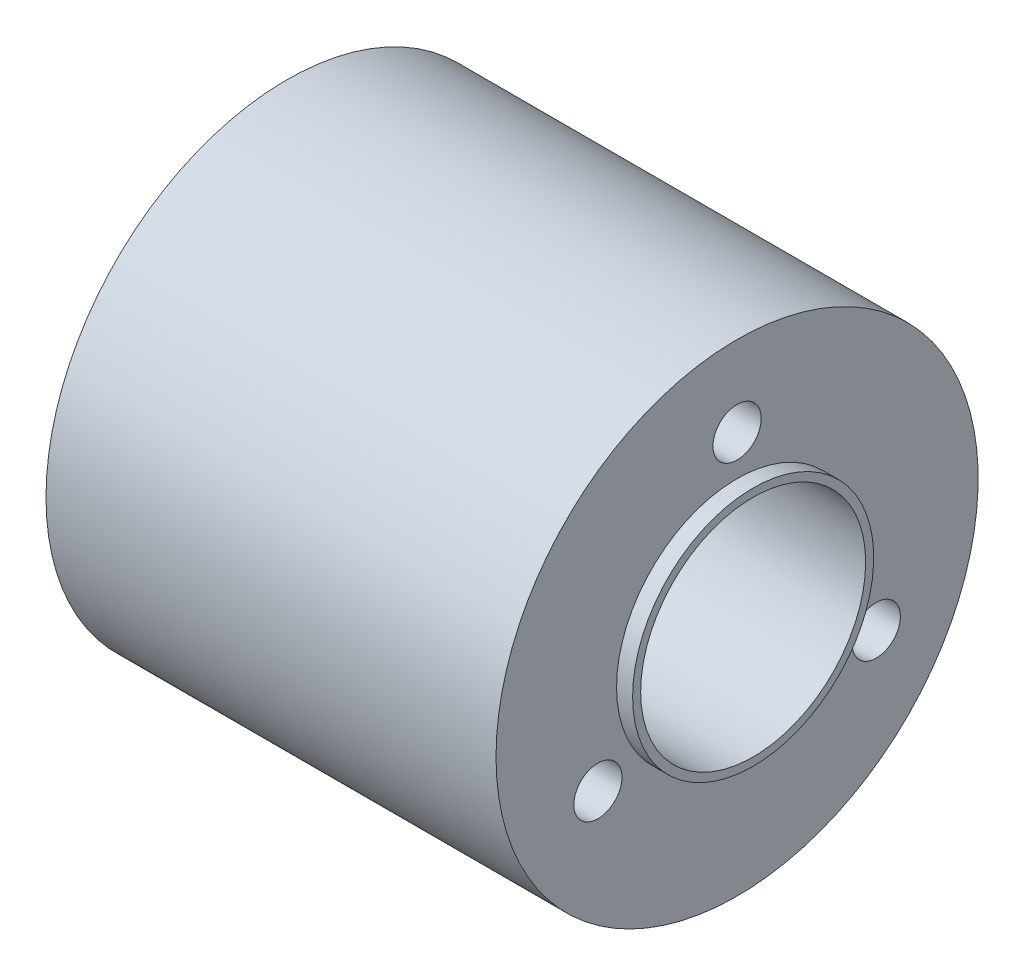
ISO-10303-21;
HEADER;
FILE_DESCRIPTION(('STEP AP214'),'2;1');
FILE_NAME('part.step','',(''),(''),'','','');
FILE_SCHEMA(('AUTOMOTIVE_DESIGN { 1 0 10303 214 1 1 1 1 }'));
ENDSEC;
DATA;
#1=APPLICATION_CONTEXT('core data for automotive mechanical design processes');
#2=APPLICATION_PROTOCOL_DEFINITION('international standard','automotive_design',2000,#1);
#3=PRODUCT_CONTEXT('',#1,'mechanical');
#4=PRODUCT('Part','Part','',(#3));
#5=PRODUCT_RELATED_PRODUCT_CATEGORY('part','',(#4));
#6=PRODUCT_DEFINITION_FORMATION('','',#4);
#7=PRODUCT_DEFINITION_CONTEXT('part definition',#1,'design');
#8=PRODUCT_DEFINITION('design','',#6,#7);
#9=PRODUCT_DEFINITION_SHAPE('','',#8);
#10=(LENGTH_UNIT() NAMED_UNIT(*) SI_UNIT(.MILLI.,.METRE.));
#11=(NAMED_UNIT(*) PLANE_ANGLE_UNIT() SI_UNIT($,.RADIAN.));
#12=(NAMED_UNIT(*) SI_UNIT($,.STERADIAN.) SOLID_ANGLE_UNIT());
#13=UNCERTAINTY_MEASURE_WITH_UNIT(LENGTH_MEASURE(1.E-05),#10,'distance_accuracy_value','');
#14=(GEOMETRIC_REPRESENTATION_CONTEXT(3) GLOBAL_UNCERTAINTY_ASSIGNED_CONTEXT((#13)) GLOBAL_UNIT_ASSIGNED_CONTEXT((#10,
#11,#12)) REPRESENTATION_CONTEXT('',''));
#15=CARTESIAN_POINT('',(0.,0.,0.));
#16=DIRECTION('',(0.,0.,1.));
#17=DIRECTION('',(1.,0.,0.));
#18=AXIS2_PLACEMENT_3D('',#15,#16,#17);
#19=CARTESIAN_POINT('',(0.,0.,0.));
#20=DIRECTION('',(-1.,0.,0.));
#21=DIRECTION('',(0.,0.,1.));
#22=AXIS2_PLACEMENT_3D('',#19,#20,#21);
#23=CYLINDRICAL_SURFACE('',#22,15.);
#24=CARTESIAN_POINT('',(28.,0.,0.));
#25=DIRECTION('',(-1.,0.,0.));
#26=DIRECTION('',(0.,0.,1.));
#27=AXIS2_PLACEMENT_3D('',#24,#25,#26);
#28=CIRCLE('',#27,15.);
#29=CARTESIAN_POINT('',(28.,0.,15.));
#30=VERTEX_POINT('',#29);
#31=EDGE_CURVE('E58',#30,#30,#28,.T.);
#32=ORIENTED_EDGE('',*,*,#31,.T.);
#33=EDGE_LOOP('',(#32));
#34=FACE_BOUND('',#33,.T.);
#35=CARTESIAN_POINT('',(0.,0.,0.));
#36=DIRECTION('',(-1.,0.,0.));
#37=DIRECTION('',(0.,0.,1.));
#38=AXIS2_PLACEMENT_3D('',#35,#36,#37);
#39=CIRCLE('',#38,15.);
#40=CARTESIAN_POINT('',(0.,0.,15.));
#41=VERTEX_POINT('',#40);
#42=EDGE_CURVE('E10',#41,#41,#39,.T.);
#43=ORIENTED_EDGE('',*,*,#42,.F.);
#44=EDGE_LOOP('',(#43));
#45=FACE_BOUND('',#44,.T.);
#46=ADVANCED_FACE('F36',(#34,#45),#23,.T.);
#47=CARTESIAN_POINT('',(0.,0.,0.));
#48=DIRECTION('',(1.,0.,0.));
#49=DIRECTION('',(0.,0.,-1.));
#50=AXIS2_PLACEMENT_3D('',#47,#48,#49);
#51=PLANE('',#50);
#52=CARTESIAN_POINT('',(0.,-5.00000000000004,-8.66025403784437));
#53=DIRECTION('',(-1.,0.,0.));
#54=DIRECTION('',(0.,0.866025403784436,-0.500000000000004));
#55=AXIS2_PLACEMENT_3D('',#52,#53,#54);
#56=CIRCLE('',#55,1.5);
#57=CARTESIAN_POINT('',(0.,-3.70096189432339,-9.41025403784437));
#58=VERTEX_POINT('',#57);
#59=EDGE_CURVE('E65',#58,#58,#56,.T.);
#60=ORIENTED_EDGE('',*,*,#59,.F.);
#61=EDGE_LOOP('',(#60));
#62=FACE_BOUND('',#61,.T.);
#63=CARTESIAN_POINT('',(0.,-4.99999999999992,8.66025403784443));
#64=DIRECTION('',(-1.,0.,0.));
#65=DIRECTION('',(0.,-0.866025403784443,-0.499999999999992));
#66=AXIS2_PLACEMENT_3D('',#63,#64,#65);
#67=CIRCLE('',#66,1.5);
#68=CARTESIAN_POINT('',(0.,-6.29903810567658,7.91025403784445));
#69=VERTEX_POINT('',#68);
#70=EDGE_CURVE('E71',#69,#69,#67,.T.);
#71=ORIENTED_EDGE('',*,*,#70,.F.);
#72=EDGE_LOOP('',(#71));
#73=FACE_BOUND('',#72,.T.);
#74=CARTESIAN_POINT('',(0.,10.,0.));
#75=DIRECTION('',(-1.,0.,0.));
#76=DIRECTION('',(0.,0.,1.));
#77=AXIS2_PLACEMENT_3D('',#74,#75,#76);
#78=CIRCLE('',#77,1.5);
#79=CARTESIAN_POINT('',(0.,10.,1.5));
#80=VERTEX_POINT('',#79);
#81=EDGE_CURVE('E61',#80,#80,#78,.T.);
#82=ORIENTED_EDGE('',*,*,#81,.F.);
#83=EDGE_LOOP('',(#82));
#84=FACE_BOUND('',#83,.T.);
#85=CARTESIAN_POINT('',(0.,0.,0.));
#86=DIRECTION('',(-1.,0.,0.));
#87=DIRECTION('',(0.,0.,1.));
#88=AXIS2_PLACEMENT_3D('',#85,#86,#87);
#89=CIRCLE('',#88,6.99999999999999);
#90=CARTESIAN_POINT('',(0.,0.,6.99999999999999));
#91=VERTEX_POINT('',#90);
#92=EDGE_CURVE('E42',#91,#91,#89,.T.);
#93=ORIENTED_EDGE('',*,*,#92,.F.);
#94=EDGE_LOOP('',(#93));
#95=FACE_BOUND('',#94,.T.);
#96=ORIENTED_EDGE('',*,*,#42,.T.);
#97=EDGE_LOOP('',(#96));
#98=FACE_BOUND('',#97,.T.);
#99=ADVANCED_FACE('F82',(#62,#73,#84,#95,#98),#51,.F.);
#100=CARTESIAN_POINT('',(0.,0.,0.));
#101=DIRECTION('',(-1.,0.,0.));
#102=DIRECTION('',(0.,0.,1.));
#103=AXIS2_PLACEMENT_3D('',#100,#101,#102);
#104=CYLINDRICAL_SURFACE('',#103,6.99999999999999);
#105=ORIENTED_EDGE('',*,*,#92,.T.);
#106=EDGE_LOOP('',(#105));
#107=FACE_BOUND('',#106,.T.);
#108=CARTESIAN_POINT('',(29.,0.,0.));
#109=DIRECTION('',(-1.,0.,0.));
#110=DIRECTION('',(0.,0.,1.));
#111=AXIS2_PLACEMENT_3D('',#108,#109,#110);
#112=CIRCLE('',#111,7.);
#113=CARTESIAN_POINT('',(29.,0.,7.));
#114=VERTEX_POINT('',#113);
#115=EDGE_CURVE('E46',#114,#114,#112,.T.);
#116=ORIENTED_EDGE('',*,*,#115,.F.);
#117=EDGE_LOOP('',(#116));
#118=FACE_BOUND('',#117,.T.);
#119=ADVANCED_FACE('F85',(#107,#118),#104,.F.);
#120=CARTESIAN_POINT('',(29.,2.01227923213309E-13,0.));
#121=DIRECTION('',(1.,0.,0.));
#122=DIRECTION('',(0.,0.,-1.));
#123=AXIS2_PLACEMENT_3D('',#120,#121,#122);
#124=PLANE('',#123);
#125=ORIENTED_EDGE('',*,*,#115,.T.);
#126=EDGE_LOOP('',(#125));
#127=FACE_BOUND('',#126,.T.);
#128=CARTESIAN_POINT('',(29.,0.,0.));
#129=DIRECTION('',(-1.,0.,0.));
#130=DIRECTION('',(0.,0.,1.));
#131=AXIS2_PLACEMENT_3D('',#128,#129,#130);
#132=CIRCLE('',#131,7.5);
#133=CARTESIAN_POINT('',(29.,0.,7.5));
#134=VERTEX_POINT('',#133);
#135=EDGE_CURVE('E50',#134,#134,#132,.T.);
#136=ORIENTED_EDGE('',*,*,#135,.F.);
#137=EDGE_LOOP('',(#136));
#138=FACE_BOUND('',#137,.T.);
#139=ADVANCED_FACE('F125',(#127,#138),#124,.T.);
#140=CARTESIAN_POINT('',(0.,0.,0.));
#141=DIRECTION('',(-1.,0.,0.));
#142=DIRECTION('',(0.,0.,1.));
#143=AXIS2_PLACEMENT_3D('',#140,#141,#142);
#144=CYLINDRICAL_SURFACE('',#143,7.5);
#145=ORIENTED_EDGE('',*,*,#135,.T.);
#146=EDGE_LOOP('',(#145));
#147=FACE_BOUND('',#146,.T.);
#148=CARTESIAN_POINT('',(28.,0.,0.));
#149=DIRECTION('',(-1.,0.,0.));
#150=DIRECTION('',(0.,0.,1.));
#151=AXIS2_PLACEMENT_3D('',#148,#149,#150);
#152=CIRCLE('',#151,7.5);
#153=CARTESIAN_POINT('',(28.,0.,7.5));
#154=VERTEX_POINT('',#153);
#155=EDGE_CURVE('E55',#154,#154,#152,.T.);
#156=ORIENTED_EDGE('',*,*,#155,.F.);
#157=EDGE_LOOP('',(#156));
#158=FACE_BOUND('',#157,.T.);
#159=ADVANCED_FACE('F103',(#147,#158),#144,.T.);
#160=CARTESIAN_POINT('',(28.,0.,0.));
#161=DIRECTION('',(1.,0.,0.));
#162=DIRECTION('',(0.,0.,-1.));
#163=AXIS2_PLACEMENT_3D('',#160,#161,#162);
#164=PLANE('',#163);
#165=CARTESIAN_POINT('',(28.,-5.00000000000004,-8.66025403784437));
#166=DIRECTION('',(1.,0.,0.));
#167=DIRECTION('',(0.,0.,-1.));
#168=AXIS2_PLACEMENT_3D('',#165,#166,#167);
#169=CIRCLE('',#168,1.5);
#170=CARTESIAN_POINT('',(28.,-5.00000000000004,-10.1602540378444));
#171=VERTEX_POINT('',#170);
#172=EDGE_CURVE('E74',#171,#171,#169,.F.);
#173=ORIENTED_EDGE('',*,*,#172,.T.);
#174=EDGE_LOOP('',(#173));
#175=FACE_BOUND('',#174,.T.);
#176=CARTESIAN_POINT('',(28.,-4.99999999999992,8.66025403784443));
#177=DIRECTION('',(1.,0.,0.));
#178=DIRECTION('',(0.,0.,-1.));
#179=AXIS2_PLACEMENT_3D('',#176,#177,#178);
#180=CIRCLE('',#179,1.5);
#181=CARTESIAN_POINT('',(28.,-4.99999999999992,7.16025403784443));
#182=VERTEX_POINT('',#181);
#183=EDGE_CURVE('E68',#182,#182,#180,.F.);
#184=ORIENTED_EDGE('',*,*,#183,.T.);
#185=EDGE_LOOP('',(#184));
#186=FACE_BOUND('',#185,.T.);
#187=CARTESIAN_POINT('',(28.,10.,0.));
#188=DIRECTION('',(1.,0.,0.));
#189=DIRECTION('',(0.,0.,-1.));
#190=AXIS2_PLACEMENT_3D('',#187,#188,#189);
#191=CIRCLE('',#190,1.5);
#192=CARTESIAN_POINT('',(28.,10.,-1.5));
#193=VERTEX_POINT('',#192);
#194=EDGE_CURVE('E62',#193,#193,#191,.F.);
#195=ORIENTED_EDGE('',*,*,#194,.T.);
#196=EDGE_LOOP('',(#195));
#197=FACE_BOUND('',#196,.T.);
#198=ORIENTED_EDGE('',*,*,#155,.T.);
#199=EDGE_LOOP('',(#198));
#200=FACE_BOUND('',#199,.T.);
#201=ORIENTED_EDGE('',*,*,#31,.F.);
#202=EDGE_LOOP('',(#201));
#203=FACE_BOUND('',#202,.T.);
#204=ADVANCED_FACE('F94',(#175,#186,#197,#200,#203),#164,.T.);
#205=CARTESIAN_POINT('',(29.001,10.,0.));
#206=DIRECTION('',(-1.,0.,0.));
#207=DIRECTION('',(0.,0.,1.));
#208=AXIS2_PLACEMENT_3D('',#205,#206,#207);
#209=CYLINDRICAL_SURFACE('',#208,1.5);
#210=ORIENTED_EDGE('',*,*,#194,.F.);
#211=EDGE_LOOP('',(#210));
#212=FACE_BOUND('',#211,.T.);
#213=ORIENTED_EDGE('',*,*,#81,.T.);
#214=EDGE_LOOP('',(#213));
#215=FACE_BOUND('',#214,.T.);
#216=ADVANCED_FACE('F91',(#212,#215),#209,.F.);
#217=CARTESIAN_POINT('',(29.001,-4.99999999999992,8.66025403784443));
#218=DIRECTION('',(-1.,0.,0.));
#219=DIRECTION('',(0.,0.,1.));
#220=AXIS2_PLACEMENT_3D('',#217,#218,#219);
#221=CYLINDRICAL_SURFACE('',#220,1.5);
#222=ORIENTED_EDGE('',*,*,#183,.F.);
#223=EDGE_LOOP('',(#222));
#224=FACE_BOUND('',#223,.T.);
#225=ORIENTED_EDGE('',*,*,#70,.T.);
#226=EDGE_LOOP('',(#225));
#227=FACE_BOUND('',#226,.T.);
#228=ADVANCED_FACE('F93',(#224,#227),#221,.F.);
#229=CARTESIAN_POINT('',(29.001,-5.00000000000004,-8.66025403784437));
#230=DIRECTION('',(-1.,0.,0.));
#231=DIRECTION('',(0.,0.,1.));
#232=AXIS2_PLACEMENT_3D('',#229,#230,#231);
#233=CYLINDRICAL_SURFACE('',#232,1.5);
#234=ORIENTED_EDGE('',*,*,#172,.F.);
#235=EDGE_LOOP('',(#234));
#236=FACE_BOUND('',#235,.T.);
#237=ORIENTED_EDGE('',*,*,#59,.T.);
#238=EDGE_LOOP('',(#237));
#239=FACE_BOUND('',#238,.T.);
#240=ADVANCED_FACE('F80',(#236,#239),#233,.F.);
#241=CLOSED_SHELL('',(#46,#99,#119,#139,#159,#204,#216,#228,#240));
#242=MANIFOLD_SOLID_BREP('B2',#241);
#243=ADVANCED_BREP_SHAPE_REPRESENTATION('',(#18,#242),#14);
#244=SHAPE_DEFINITION_REPRESENTATION(#9,#243);
ENDSEC;
END-ISO-10303-21;
